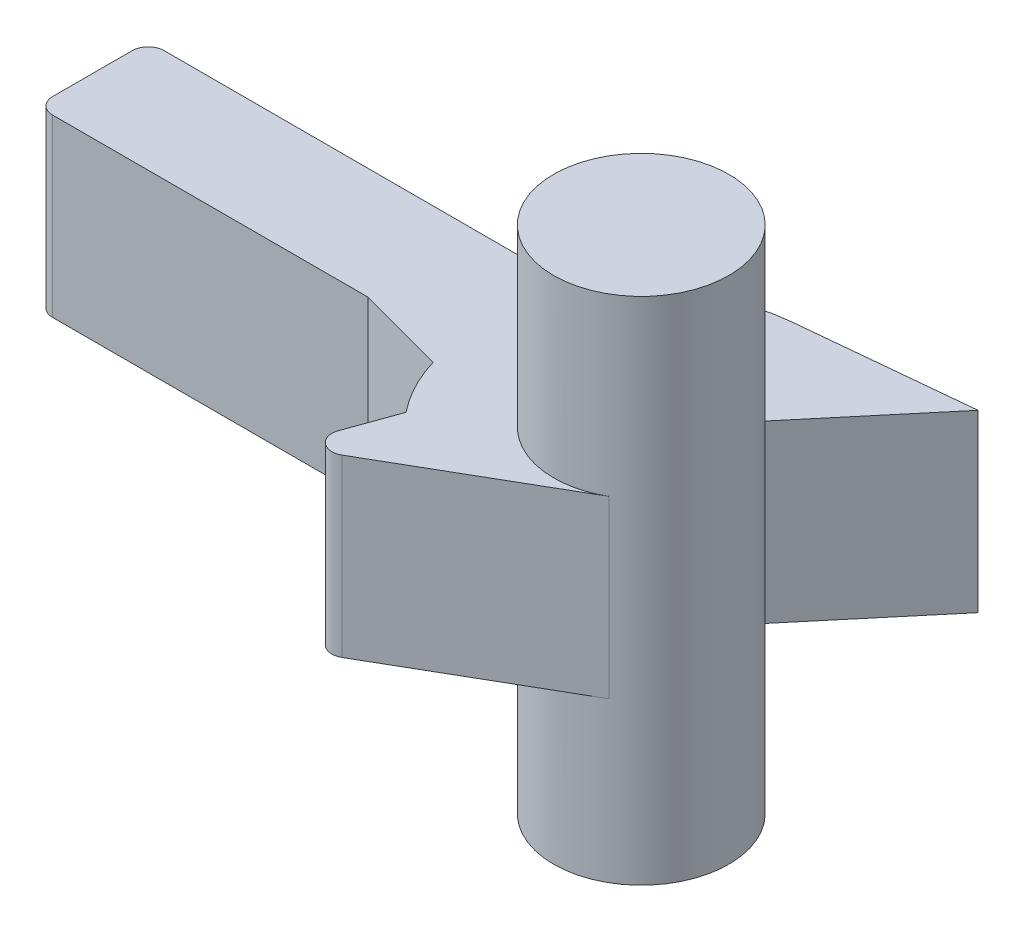
ISO-10303-21;
HEADER;
FILE_DESCRIPTION(('STEP AP214'),'2;1');
FILE_NAME('part.step','',(''),(''),'','','');
FILE_SCHEMA(('AUTOMOTIVE_DESIGN { 1 0 10303 214 1 1 1 1 }'));
ENDSEC;
DATA;
#1=APPLICATION_CONTEXT('core data for automotive mechanical design processes');
#2=APPLICATION_PROTOCOL_DEFINITION('international standard','automotive_design',2000,#1);
#3=PRODUCT_CONTEXT('',#1,'mechanical');
#4=PRODUCT('Part','Part','',(#3));
#5=PRODUCT_RELATED_PRODUCT_CATEGORY('part','',(#4));
#6=PRODUCT_DEFINITION_FORMATION('','',#4);
#7=PRODUCT_DEFINITION_CONTEXT('part definition',#1,'design');
#8=PRODUCT_DEFINITION('design','',#6,#7);
#9=PRODUCT_DEFINITION_SHAPE('','',#8);
#10=(LENGTH_UNIT() NAMED_UNIT(*) SI_UNIT(.MILLI.,.METRE.));
#11=(NAMED_UNIT(*) PLANE_ANGLE_UNIT() SI_UNIT($,.RADIAN.));
#12=(NAMED_UNIT(*) SI_UNIT($,.STERADIAN.) SOLID_ANGLE_UNIT());
#13=UNCERTAINTY_MEASURE_WITH_UNIT(LENGTH_MEASURE(1.E-05),#10,'distance_accuracy_value','');
#14=(GEOMETRIC_REPRESENTATION_CONTEXT(3) GLOBAL_UNCERTAINTY_ASSIGNED_CONTEXT((#13)) GLOBAL_UNIT_ASSIGNED_CONTEXT((#10,
#11,#12)) REPRESENTATION_CONTEXT('',''));
#15=CARTESIAN_POINT('',(0.,0.,0.));
#16=DIRECTION('',(0.,0.,1.));
#17=DIRECTION('',(1.,0.,0.));
#18=AXIS2_PLACEMENT_3D('',#15,#16,#17);
#19=CARTESIAN_POINT('',(0.,2.2,0.));
#20=DIRECTION('',(0.,-1.,0.));
#21=DIRECTION('',(0.,0.,-1.));
#22=AXIS2_PLACEMENT_3D('',#19,#20,#21);
#23=CYLINDRICAL_SURFACE('',#22,2.1);
#24=CARTESIAN_POINT('',(0.,0.,0.));
#25=DIRECTION('',(0.,1.,0.));
#26=DIRECTION('',(0.,0.,1.));
#27=AXIS2_PLACEMENT_3D('',#24,#25,#26);
#28=CIRCLE('',#27,2.1);
#29=CARTESIAN_POINT('',(-1.63925965501056,0.,1.31256534445134));
#30=VERTEX_POINT('',#29);
#31=CARTESIAN_POINT('',(-2.01260159665678,0.,0.599528825941312));
#32=VERTEX_POINT('',#31);
#33=EDGE_CURVE('E231',#30,#32,#28,.F.);
#34=ORIENTED_EDGE('',*,*,#33,.F.);
#35=DIRECTION('',(0.,-1.,0.));
#36=VECTOR('',#35,1.);
#37=CARTESIAN_POINT('',(-1.63925965501056,2.2,1.31256534445134));
#38=LINE('',#37,#36);
#39=CARTESIAN_POINT('',(-1.63925965501056,2.2,1.31256534445134));
#40=VERTEX_POINT('',#39);
#41=EDGE_CURVE('E151',#40,#30,#38,.T.);
#42=ORIENTED_EDGE('',*,*,#41,.F.);
#43=CARTESIAN_POINT('',(0.,2.2,0.));
#44=DIRECTION('',(0.,1.,0.));
#45=DIRECTION('',(0.,0.,1.));
#46=AXIS2_PLACEMENT_3D('',#43,#44,#45);
#47=CIRCLE('',#46,2.1);
#48=CARTESIAN_POINT('',(-2.01260159665678,2.2,0.599528825941312));
#49=VERTEX_POINT('',#48);
#50=EDGE_CURVE('E186',#40,#49,#47,.F.);
#51=ORIENTED_EDGE('',*,*,#50,.T.);
#52=DIRECTION('',(0.,-1.,0.));
#53=VECTOR('',#52,1.);
#54=CARTESIAN_POINT('',(-2.01260159665678,2.2,0.599528825941312));
#55=LINE('',#54,#53);
#56=EDGE_CURVE('E187',#49,#32,#55,.T.);
#57=ORIENTED_EDGE('',*,*,#56,.T.);
#58=EDGE_LOOP('',(#34,#42,#51,#57));
#59=FACE_BOUND('',#58,.T.);
#60=ADVANCED_FACE('F37',(#59),#23,.T.);
#61=CARTESIAN_POINT('',(-1.03544019896915,2.2,-0.371299871207522));
#62=DIRECTION('',(-0.941309271790139,0.,-0.337545337461383));
#63=DIRECTION('',(-0.337545337461383,0.,0.941309271790139));
#64=AXIS2_PLACEMENT_3D('',#61,#62,#63);
#65=PLANE('',#64);
#66=DIRECTION('',(0.337545337461383,0.,-0.941309271790139));
#67=VECTOR('',#66,1.);
#68=CARTESIAN_POINT('',(-1.03544019896915,0.,-0.371299871207522));
#69=LINE('',#68,#67);
#70=CARTESIAN_POINT('',(-1.863960572738,0.,1.93918652318646));
#71=VERTEX_POINT('',#70);
#72=EDGE_CURVE('E171',#71,#30,#69,.T.);
#73=ORIENTED_EDGE('',*,*,#72,.F.);
#74=DIRECTION('',(0.,-1.,0.));
#75=VECTOR('',#74,1.);
#76=CARTESIAN_POINT('',(-1.863960572738,2.2,1.93918652318646));
#77=LINE('',#76,#75);
#78=CARTESIAN_POINT('',(-1.863960572738,2.2,1.93918652318646));
#79=VERTEX_POINT('',#78);
#80=EDGE_CURVE('E11',#71,#79,#77,.F.);
#81=ORIENTED_EDGE('',*,*,#80,.T.);
#82=DIRECTION('',(0.337545337461383,0.,-0.941309271790139));
#83=VECTOR('',#82,1.);
#84=CARTESIAN_POINT('',(-1.03544019896915,2.2,-0.371299871207522));
#85=LINE('',#84,#83);
#86=EDGE_CURVE('E288',#79,#40,#85,.T.);
#87=ORIENTED_EDGE('',*,*,#86,.T.);
#88=ORIENTED_EDGE('',*,*,#41,.T.);
#89=EDGE_LOOP('',(#73,#81,#87,#88));
#90=FACE_BOUND('',#89,.T.);
#91=ADVANCED_FACE('F228',(#90),#65,.T.);
#92=CARTESIAN_POINT('',(0.550000000000005,2.2,0.95262794416288));
#93=DIRECTION('',(0.500000000000005,0.,0.866025403784436));
#94=DIRECTION('',(0.866025403784436,0.,-0.500000000000005));
#95=AXIS2_PLACEMENT_3D('',#92,#93,#94);
#96=PLANE('',#95);
#97=DIRECTION('',(-0.866025403784436,0.,0.500000000000005));
#98=VECTOR('',#97,1.);
#99=CARTESIAN_POINT('',(0.550000000000005,2.2,0.95262794416288));
#100=LINE('',#99,#98);
#101=CARTESIAN_POINT('',(0.550000000000005,2.2,0.95262794416288));
#102=VERTEX_POINT('',#101);
#103=CARTESIAN_POINT('',(-1.57569871837997,2.2,2.17990067143562));
#104=VERTEX_POINT('',#103);
#105=EDGE_CURVE('E225',#102,#104,#100,.T.);
#106=ORIENTED_EDGE('',*,*,#105,.T.);
#107=DIRECTION('',(0.,-1.,0.));
#108=VECTOR('',#107,1.);
#109=CARTESIAN_POINT('',(-1.57569871837997,2.2,2.17990067143562));
#110=LINE('',#109,#108);
#111=CARTESIAN_POINT('',(-1.57569871837997,0.,2.17990067143562));
#112=VERTEX_POINT('',#111);
#113=EDGE_CURVE('E45',#104,#112,#110,.T.);
#114=ORIENTED_EDGE('',*,*,#113,.T.);
#115=DIRECTION('',(-0.866025403784436,0.,0.500000000000005));
#116=VECTOR('',#115,1.);
#117=CARTESIAN_POINT('',(0.550000000000005,0.,0.95262794416288));
#118=LINE('',#117,#116);
#119=CARTESIAN_POINT('',(0.550000000000005,0.,0.95262794416288));
#120=VERTEX_POINT('',#119);
#121=EDGE_CURVE('E167',#120,#112,#118,.T.);
#122=ORIENTED_EDGE('',*,*,#121,.F.);
#123=DIRECTION('',(0.,-1.,0.));
#124=VECTOR('',#123,1.);
#125=CARTESIAN_POINT('',(0.550000000000005,2.2,0.95262794416288));
#126=LINE('',#125,#124);
#127=EDGE_CURVE('E145',#102,#120,#126,.T.);
#128=ORIENTED_EDGE('',*,*,#127,.F.);
#129=EDGE_LOOP('',(#106,#114,#122,#128));
#130=FACE_BOUND('',#129,.T.);
#131=ADVANCED_FACE('F224',(#130),#96,.T.);
#132=CARTESIAN_POINT('',(0.,2.2,0.));
#133=DIRECTION('',(0.,-1.,0.));
#134=DIRECTION('',(0.,0.,-1.));
#135=AXIS2_PLACEMENT_3D('',#132,#133,#134);
#136=CYLINDRICAL_SURFACE('',#135,1.1);
#137=ORIENTED_EDGE('',*,*,#127,.T.);
#138=CARTESIAN_POINT('',(0.,0.,0.));
#139=DIRECTION('',(0.,1.,0.));
#140=DIRECTION('',(0.,0.,1.));
#141=AXIS2_PLACEMENT_3D('',#138,#139,#140);
#142=CIRCLE('',#141,1.1);
#143=CARTESIAN_POINT('',(0.707066370655197,0.,-0.842648887430873));
#144=VERTEX_POINT('',#143);
#145=EDGE_CURVE('E137',#144,#120,#142,.T.);
#146=ORIENTED_EDGE('',*,*,#145,.F.);
#147=DIRECTION('',(0.,-1.,0.));
#148=VECTOR('',#147,1.);
#149=CARTESIAN_POINT('',(0.707066370655197,2.2,-0.842648887430873));
#150=LINE('',#149,#148);
#151=CARTESIAN_POINT('',(0.707066370655197,2.2,-0.842648887430873));
#152=VERTEX_POINT('',#151);
#153=EDGE_CURVE('E142',#152,#144,#150,.T.);
#154=ORIENTED_EDGE('',*,*,#153,.F.);
#155=CARTESIAN_POINT('',(0.,2.2,0.));
#156=DIRECTION('',(0.,1.,0.));
#157=DIRECTION('',(0.,0.,1.));
#158=AXIS2_PLACEMENT_3D('',#155,#156,#157);
#159=CIRCLE('',#158,1.1);
#160=EDGE_CURVE('E277',#152,#102,#159,.T.);
#161=ORIENTED_EDGE('',*,*,#160,.T.);
#162=EDGE_LOOP('',(#137,#146,#154,#161));
#163=FACE_BOUND('',#162,.T.);
#164=CARTESIAN_POINT('',(0.,-2.,0.));
#165=DIRECTION('',(0.,1.,0.));
#166=DIRECTION('',(0.,0.,1.));
#167=AXIS2_PLACEMENT_3D('',#164,#165,#166);
#168=CIRCLE('',#167,1.1);
#169=CARTESIAN_POINT('',(0.,-2.,1.1));
#170=VERTEX_POINT('',#169);
#171=EDGE_CURVE('E279',#170,#170,#168,.T.);
#172=ORIENTED_EDGE('',*,*,#171,.T.);
#173=EDGE_LOOP('',(#172));
#174=FACE_BOUND('',#173,.T.);
#175=CARTESIAN_POINT('',(0.,4.4,0.));
#176=DIRECTION('',(0.,1.,0.));
#177=DIRECTION('',(0.,0.,1.));
#178=AXIS2_PLACEMENT_3D('',#175,#176,#177);
#179=CIRCLE('',#178,1.1);
#180=CARTESIAN_POINT('',(0.,4.4,1.1));
#181=VERTEX_POINT('',#180);
#182=EDGE_CURVE('E282',#181,#181,#179,.T.);
#183=ORIENTED_EDGE('',*,*,#182,.F.);
#184=EDGE_LOOP('',(#183));
#185=FACE_BOUND('',#184,.T.);
#186=ADVANCED_FACE('F139',(#163,#174,#185),#136,.T.);
#187=CARTESIAN_POINT('',(0.,2.2,0.));
#188=DIRECTION('',(-0.766044443118975,0.,-0.642787609686543));
#189=DIRECTION('',(-0.642787609686543,0.,0.766044443118975));
#190=AXIS2_PLACEMENT_3D('',#187,#188,#189);
#191=PLANE('',#190);
#192=DIRECTION('',(0.642787609686543,0.,-0.766044443118975));
#193=VECTOR('',#192,1.);
#194=CARTESIAN_POINT('',(0.,0.,0.));
#195=LINE('',#194,#193);
#196=CARTESIAN_POINT('',(1.92836282905963,0.,-2.29813332935693));
#197=VERTEX_POINT('',#196);
#198=EDGE_CURVE('E156',#144,#197,#195,.T.);
#199=ORIENTED_EDGE('',*,*,#198,.T.);
#200=DIRECTION('',(0.,-1.,0.));
#201=VECTOR('',#200,1.);
#202=CARTESIAN_POINT('',(1.92836282905963,2.2,-2.29813332935693));
#203=LINE('',#202,#201);
#204=CARTESIAN_POINT('',(1.92836282905963,2.2,-2.29813332935693));
#205=VERTEX_POINT('',#204);
#206=EDGE_CURVE('E159',#205,#197,#203,.T.);
#207=ORIENTED_EDGE('',*,*,#206,.F.);
#208=DIRECTION('',(0.642787609686543,0.,-0.766044443118975));
#209=VECTOR('',#208,1.);
#210=CARTESIAN_POINT('',(0.,2.2,0.));
#211=LINE('',#210,#209);
#212=EDGE_CURVE('E158',#152,#205,#211,.T.);
#213=ORIENTED_EDGE('',*,*,#212,.F.);
#214=ORIENTED_EDGE('',*,*,#153,.T.);
#215=EDGE_LOOP('',(#199,#207,#213,#214));
#216=FACE_BOUND('',#215,.T.);
#217=ADVANCED_FACE('F154',(#216),#191,.F.);
#218=CARTESIAN_POINT('',(-0.203939042120377,2.2,-2.09007389034432));
#219=DIRECTION('',(0.0971138295811318,0.,0.995273281116341));
#220=DIRECTION('',(0.995273281116341,0.,-0.0971138295811318));
#221=AXIS2_PLACEMENT_3D('',#218,#219,#220);
#222=PLANE('',#221);
#223=DIRECTION('',(-0.995273281116341,0.,0.0971138295811318));
#224=VECTOR('',#223,1.);
#225=CARTESIAN_POINT('',(-0.203939042120377,0.,-2.09007389034432));
#226=LINE('',#225,#224);
#227=CARTESIAN_POINT('',(-0.203939042120377,0.,-2.09007389034432));
#228=VERTEX_POINT('',#227);
#229=EDGE_CURVE('E166',#197,#228,#226,.T.);
#230=ORIENTED_EDGE('',*,*,#229,.T.);
#231=DIRECTION('',(0.,-1.,0.));
#232=VECTOR('',#231,1.);
#233=CARTESIAN_POINT('',(-0.203939042120377,2.2,-2.09007389034432));
#234=LINE('',#233,#232);
#235=CARTESIAN_POINT('',(-0.203939042120377,2.2,-2.09007389034432));
#236=VERTEX_POINT('',#235);
#237=EDGE_CURVE('E196',#236,#228,#234,.T.);
#238=ORIENTED_EDGE('',*,*,#237,.F.);
#239=DIRECTION('',(-0.995273281116341,0.,0.0971138295811318));
#240=VECTOR('',#239,1.);
#241=CARTESIAN_POINT('',(-0.203939042120377,2.2,-2.09007389034432));
#242=LINE('',#241,#240);
#243=EDGE_CURVE('E292',#205,#236,#242,.T.);
#244=ORIENTED_EDGE('',*,*,#243,.F.);
#245=ORIENTED_EDGE('',*,*,#206,.T.);
#246=EDGE_LOOP('',(#230,#238,#244,#245));
#247=FACE_BOUND('',#246,.T.);
#248=ADVANCED_FACE('F310',(#247),#222,.F.);
#249=CARTESIAN_POINT('',(0.,2.2,0.));
#250=DIRECTION('',(0.,-1.,0.));
#251=DIRECTION('',(0.,0.,-1.));
#252=AXIS2_PLACEMENT_3D('',#249,#250,#251);
#253=CYLINDRICAL_SURFACE('',#252,2.1);
#254=CARTESIAN_POINT('',(0.,0.,0.));
#255=DIRECTION('',(0.,1.,0.));
#256=DIRECTION('',(0.,0.,1.));
#257=AXIS2_PLACEMENT_3D('',#254,#255,#256);
#258=CIRCLE('',#257,2.1);
#259=CARTESIAN_POINT('',(-1.78885438199983,0.,-1.1));
#260=VERTEX_POINT('',#259);
#261=EDGE_CURVE('E169',#260,#228,#258,.F.);
#262=ORIENTED_EDGE('',*,*,#261,.F.);
#263=DIRECTION('',(0.,-1.,0.));
#264=VECTOR('',#263,1.);
#265=CARTESIAN_POINT('',(-1.78885438199983,2.2,-1.1));
#266=LINE('',#265,#264);
#267=CARTESIAN_POINT('',(-1.78885438199983,2.2,-1.1));
#268=VERTEX_POINT('',#267);
#269=EDGE_CURVE('E193',#268,#260,#266,.T.);
#270=ORIENTED_EDGE('',*,*,#269,.F.);
#271=CARTESIAN_POINT('',(0.,2.2,0.));
#272=DIRECTION('',(0.,1.,0.));
#273=DIRECTION('',(0.,0.,1.));
#274=AXIS2_PLACEMENT_3D('',#271,#272,#273);
#275=CIRCLE('',#274,2.1);
#276=EDGE_CURVE('E294',#268,#236,#275,.F.);
#277=ORIENTED_EDGE('',*,*,#276,.T.);
#278=ORIENTED_EDGE('',*,*,#237,.T.);
#279=EDGE_LOOP('',(#262,#270,#277,#278));
#280=FACE_BOUND('',#279,.T.);
#281=ADVANCED_FACE('F306',(#280),#253,.T.);
#282=CARTESIAN_POINT('',(0.,2.2,-1.1));
#283=DIRECTION('',(0.,0.,-1.));
#284=DIRECTION('',(-1.,0.,0.));
#285=AXIS2_PLACEMENT_3D('',#282,#283,#284);
#286=PLANE('',#285);
#287=DIRECTION('',(1.,0.,0.));
#288=VECTOR('',#287,1.);
#289=CARTESIAN_POINT('',(0.,0.,-1.1));
#290=LINE('',#289,#288);
#291=CARTESIAN_POINT('',(-7.08885438199983,0.,-1.1));
#292=VERTEX_POINT('',#291);
#293=EDGE_CURVE('E176',#292,#260,#290,.T.);
#294=ORIENTED_EDGE('',*,*,#293,.F.);
#295=DIRECTION('',(0.,-1.,0.));
#296=VECTOR('',#295,1.);
#297=CARTESIAN_POINT('',(-7.08885438199983,2.2,-1.1));
#298=LINE('',#297,#296);
#299=CARTESIAN_POINT('',(-7.08885438199983,2.2,-1.1));
#300=VERTEX_POINT('',#299);
#301=EDGE_CURVE('E220',#292,#300,#298,.F.);
#302=ORIENTED_EDGE('',*,*,#301,.T.);
#303=DIRECTION('',(1.,0.,0.));
#304=VECTOR('',#303,1.);
#305=CARTESIAN_POINT('',(0.,2.2,-1.1));
#306=LINE('',#305,#304);
#307=EDGE_CURVE('E273',#300,#268,#306,.T.);
#308=ORIENTED_EDGE('',*,*,#307,.T.);
#309=ORIENTED_EDGE('',*,*,#269,.T.);
#310=EDGE_LOOP('',(#294,#302,#308,#309));
#311=FACE_BOUND('',#310,.T.);
#312=ADVANCED_FACE('F300',(#311),#286,.T.);
#313=CARTESIAN_POINT('',(-7.28885438199983,2.2,0.));
#314=DIRECTION('',(1.,0.,0.));
#315=DIRECTION('',(0.,0.,-1.));
#316=AXIS2_PLACEMENT_3D('',#313,#314,#315);
#317=PLANE('',#316);
#318=DIRECTION('',(0.,0.,1.));
#319=VECTOR('',#318,1.);
#320=CARTESIAN_POINT('',(-7.28885438199983,0.,0.));
#321=LINE('',#320,#319);
#322=CARTESIAN_POINT('',(-7.28885438199983,0.,-0.899999999999999));
#323=VERTEX_POINT('',#322);
#324=CARTESIAN_POINT('',(-7.28885438199983,0.,0.100000000000001));
#325=VERTEX_POINT('',#324);
#326=EDGE_CURVE('E178',#323,#325,#321,.T.);
#327=ORIENTED_EDGE('',*,*,#326,.T.);
#328=DIRECTION('',(0.,-1.,0.));
#329=VECTOR('',#328,1.);
#330=CARTESIAN_POINT('',(-7.28885438199983,2.2,0.100000000000001));
#331=LINE('',#330,#329);
#332=CARTESIAN_POINT('',(-7.28885438199983,2.2,0.100000000000001));
#333=VERTEX_POINT('',#332);
#334=EDGE_CURVE('E213',#325,#333,#331,.F.);
#335=ORIENTED_EDGE('',*,*,#334,.T.);
#336=DIRECTION('',(0.,0.,1.));
#337=VECTOR('',#336,1.);
#338=CARTESIAN_POINT('',(-7.28885438199983,2.2,0.));
#339=LINE('',#338,#337);
#340=CARTESIAN_POINT('',(-7.28885438199983,2.2,-0.899999999999999));
#341=VERTEX_POINT('',#340);
#342=EDGE_CURVE('E267',#341,#333,#339,.T.);
#343=ORIENTED_EDGE('',*,*,#342,.F.);
#344=DIRECTION('',(0.,-1.,0.));
#345=VECTOR('',#344,1.);
#346=CARTESIAN_POINT('',(-7.28885438199983,0.,-0.899999999999999));
#347=LINE('',#346,#345);
#348=EDGE_CURVE('E210',#341,#323,#347,.T.);
#349=ORIENTED_EDGE('',*,*,#348,.T.);
#350=EDGE_LOOP('',(#327,#335,#343,#349));
#351=FACE_BOUND('',#350,.T.);
#352=ADVANCED_FACE('F314',(#351),#317,.F.);
#353=CARTESIAN_POINT('',(0.,2.2,0.300000000000001));
#354=DIRECTION('',(0.,0.,-1.));
#355=DIRECTION('',(-1.,0.,0.));
#356=AXIS2_PLACEMENT_3D('',#353,#354,#355);
#357=PLANE('',#356);
#358=DIRECTION('',(1.,0.,0.));
#359=VECTOR('',#358,1.);
#360=CARTESIAN_POINT('',(0.,2.2,0.300000000000001));
#361=LINE('',#360,#359);
#362=CARTESIAN_POINT('',(-7.08885438199983,2.2,0.300000000000001));
#363=VERTEX_POINT('',#362);
#364=CARTESIAN_POINT('',(-3.13045839340119,2.2,0.300000000000001));
#365=VERTEX_POINT('',#364);
#366=EDGE_CURVE('E264',#363,#365,#361,.T.);
#367=ORIENTED_EDGE('',*,*,#366,.F.);
#368=DIRECTION('',(0.,-1.,0.));
#369=VECTOR('',#368,1.);
#370=CARTESIAN_POINT('',(-7.08885438199983,2.2,0.300000000000001));
#371=LINE('',#370,#369);
#372=CARTESIAN_POINT('',(-7.08885438199983,0.,0.300000000000001));
#373=VERTEX_POINT('',#372);
#374=EDGE_CURVE('E150',#363,#373,#371,.T.);
#375=ORIENTED_EDGE('',*,*,#374,.T.);
#376=DIRECTION('',(1.,0.,0.));
#377=VECTOR('',#376,1.);
#378=CARTESIAN_POINT('',(0.,0.,0.300000000000001));
#379=LINE('',#378,#377);
#380=CARTESIAN_POINT('',(-3.13045839340119,0.,0.300000000000001));
#381=VERTEX_POINT('',#380);
#382=EDGE_CURVE('E181',#373,#381,#379,.T.);
#383=ORIENTED_EDGE('',*,*,#382,.T.);
#384=DIRECTION('',(0.,-1.,0.));
#385=VECTOR('',#384,1.);
#386=CARTESIAN_POINT('',(-3.13045839340119,2.2,0.300000000000001));
#387=LINE('',#386,#385);
#388=EDGE_CURVE('E189',#365,#381,#387,.T.);
#389=ORIENTED_EDGE('',*,*,#388,.F.);
#390=EDGE_LOOP('',(#367,#375,#383,#389));
#391=FACE_BOUND('',#390,.T.);
#392=ADVANCED_FACE('F269',(#391),#357,.F.);
#393=CARTESIAN_POINT('',(-0.284700949612777,2.2,1.06251840891797));
#394=DIRECTION('',(-0.258819045102524,0.,0.965925826289067));
#395=DIRECTION('',(0.965925826289068,0.,0.258819045102524));
#396=AXIS2_PLACEMENT_3D('',#393,#394,#395);
#397=PLANE('',#396);
#398=DIRECTION('',(-0.965925826289067,0.,-0.258819045102524));
#399=VECTOR('',#398,1.);
#400=CARTESIAN_POINT('',(-0.284700949612777,0.,1.06251840891797));
#401=LINE('',#400,#399);
#402=EDGE_CURVE('E183',#32,#381,#401,.T.);
#403=ORIENTED_EDGE('',*,*,#402,.F.);
#404=ORIENTED_EDGE('',*,*,#56,.F.);
#405=DIRECTION('',(-0.965925826289067,0.,-0.258819045102524));
#406=VECTOR('',#405,1.);
#407=CARTESIAN_POINT('',(-0.284700949612777,2.2,1.06251840891797));
#408=LINE('',#407,#406);
#409=EDGE_CURVE('E190',#49,#365,#408,.T.);
#410=ORIENTED_EDGE('',*,*,#409,.T.);
#411=ORIENTED_EDGE('',*,*,#388,.T.);
#412=EDGE_LOOP('',(#403,#404,#410,#411));
#413=FACE_BOUND('',#412,.T.);
#414=ADVANCED_FACE('F316',(#413),#397,.T.);
#415=CARTESIAN_POINT('',(0.,2.2,0.));
#416=DIRECTION('',(0.,1.,0.));
#417=DIRECTION('',(0.,0.,1.));
#418=AXIS2_PLACEMENT_3D('',#415,#416,#417);
#419=PLANE('',#418);
#420=ORIENTED_EDGE('',*,*,#342,.T.);
#421=CARTESIAN_POINT('',(-7.08885438199983,2.2,0.100000000000001));
#422=DIRECTION('',(0.,1.,0.));
#423=DIRECTION('',(0.,0.,1.));
#424=AXIS2_PLACEMENT_3D('',#421,#422,#423);
#425=CIRCLE('',#424,0.2);
#426=EDGE_CURVE('E218',#333,#363,#425,.T.);
#427=ORIENTED_EDGE('',*,*,#426,.T.);
#428=ORIENTED_EDGE('',*,*,#366,.T.);
#429=ORIENTED_EDGE('',*,*,#409,.F.);
#430=ORIENTED_EDGE('',*,*,#50,.F.);
#431=ORIENTED_EDGE('',*,*,#86,.F.);
#432=CARTESIAN_POINT('',(-1.67569871837998,2.2,2.00669559067873));
#433=DIRECTION('',(0.,1.,0.));
#434=DIRECTION('',(0.,0.,1.));
#435=AXIS2_PLACEMENT_3D('',#432,#433,#434);
#436=CIRCLE('',#435,0.2);
#437=EDGE_CURVE('E52',#79,#104,#436,.T.);
#438=ORIENTED_EDGE('',*,*,#437,.T.);
#439=ORIENTED_EDGE('',*,*,#105,.F.);
#440=ORIENTED_EDGE('',*,*,#160,.F.);
#441=ORIENTED_EDGE('',*,*,#212,.T.);
#442=ORIENTED_EDGE('',*,*,#243,.T.);
#443=ORIENTED_EDGE('',*,*,#276,.F.);
#444=ORIENTED_EDGE('',*,*,#307,.F.);
#445=CARTESIAN_POINT('',(-7.08885438199983,2.2,-0.899999999999999));
#446=DIRECTION('',(0.,1.,0.));
#447=DIRECTION('',(0.,0.,1.));
#448=AXIS2_PLACEMENT_3D('',#445,#446,#447);
#449=CIRCLE('',#448,0.2);
#450=EDGE_CURVE('E216',#300,#341,#449,.T.);
#451=ORIENTED_EDGE('',*,*,#450,.T.);
#452=EDGE_LOOP('',(#420,#427,#428,#429,#430,#431,#438,#439,#440,#441,#442,#443,#444,#451));
#453=FACE_BOUND('',#452,.T.);
#454=ADVANCED_FACE('F262',(#453),#419,.T.);
#455=CARTESIAN_POINT('',(0.,0.,0.));
#456=DIRECTION('',(0.,1.,0.));
#457=DIRECTION('',(0.,0.,1.));
#458=AXIS2_PLACEMENT_3D('',#455,#456,#457);
#459=PLANE('',#458);
#460=ORIENTED_EDGE('',*,*,#382,.F.);
#461=CARTESIAN_POINT('',(-7.08885438199983,0.,0.100000000000001));
#462=DIRECTION('',(0.,1.,0.));
#463=DIRECTION('',(0.,0.,1.));
#464=AXIS2_PLACEMENT_3D('',#461,#462,#463);
#465=CIRCLE('',#464,0.2);
#466=EDGE_CURVE('E208',#373,#325,#465,.F.);
#467=ORIENTED_EDGE('',*,*,#466,.T.);
#468=ORIENTED_EDGE('',*,*,#326,.F.);
#469=CARTESIAN_POINT('',(-7.08885438199983,0.,-0.899999999999999));
#470=DIRECTION('',(0.,1.,0.));
#471=DIRECTION('',(0.,0.,1.));
#472=AXIS2_PLACEMENT_3D('',#469,#470,#471);
#473=CIRCLE('',#472,0.2);
#474=EDGE_CURVE('E206',#323,#292,#473,.F.);
#475=ORIENTED_EDGE('',*,*,#474,.T.);
#476=ORIENTED_EDGE('',*,*,#293,.T.);
#477=ORIENTED_EDGE('',*,*,#261,.T.);
#478=ORIENTED_EDGE('',*,*,#229,.F.);
#479=ORIENTED_EDGE('',*,*,#198,.F.);
#480=ORIENTED_EDGE('',*,*,#145,.T.);
#481=ORIENTED_EDGE('',*,*,#121,.T.);
#482=CARTESIAN_POINT('',(-1.67569871837998,0.,2.00669559067873));
#483=DIRECTION('',(0.,1.,0.));
#484=DIRECTION('',(0.,0.,1.));
#485=AXIS2_PLACEMENT_3D('',#482,#483,#484);
#486=CIRCLE('',#485,0.2);
#487=EDGE_CURVE('E204',#112,#71,#486,.F.);
#488=ORIENTED_EDGE('',*,*,#487,.T.);
#489=ORIENTED_EDGE('',*,*,#72,.T.);
#490=ORIENTED_EDGE('',*,*,#33,.T.);
#491=ORIENTED_EDGE('',*,*,#402,.T.);
#492=EDGE_LOOP('',(#460,#467,#468,#475,#476,#477,#478,#479,#480,#481,#488,#489,#490,#491));
#493=FACE_BOUND('',#492,.T.);
#494=ADVANCED_FACE('F163',(#493),#459,.F.);
#495=CARTESIAN_POINT('',(0.,-2.,0.));
#496=DIRECTION('',(0.,1.,0.));
#497=DIRECTION('',(0.,0.,1.));
#498=AXIS2_PLACEMENT_3D('',#495,#496,#497);
#499=PLANE('',#498);
#500=ORIENTED_EDGE('',*,*,#171,.F.);
#501=EDGE_LOOP('',(#500));
#502=FACE_BOUND('',#501,.T.);
#503=ADVANCED_FACE('F254',(#502),#499,.F.);
#504=CARTESIAN_POINT('',(0.,4.4,0.));
#505=DIRECTION('',(0.,1.,0.));
#506=DIRECTION('',(0.,0.,1.));
#507=AXIS2_PLACEMENT_3D('',#504,#505,#506);
#508=PLANE('',#507);
#509=ORIENTED_EDGE('',*,*,#182,.T.);
#510=EDGE_LOOP('',(#509));
#511=FACE_BOUND('',#510,.T.);
#512=ADVANCED_FACE('F249',(#511),#508,.T.);
#513=CARTESIAN_POINT('',(-7.08885438199983,2.2,0.100000000000001));
#514=DIRECTION('',(0.,-1.,0.));
#515=DIRECTION('',(0.,0.,-1.));
#516=AXIS2_PLACEMENT_3D('',#513,#514,#515);
#517=CYLINDRICAL_SURFACE('',#516,0.2);
#518=ORIENTED_EDGE('',*,*,#426,.F.);
#519=ORIENTED_EDGE('',*,*,#334,.F.);
#520=ORIENTED_EDGE('',*,*,#466,.F.);
#521=ORIENTED_EDGE('',*,*,#374,.F.);
#522=EDGE_LOOP('',(#518,#519,#520,#521));
#523=FACE_BOUND('',#522,.T.);
#524=ADVANCED_FACE('F237',(#523),#517,.T.);
#525=CARTESIAN_POINT('',(-7.08885438199983,2.2,-0.899999999999999));
#526=DIRECTION('',(0.,1.,0.));
#527=DIRECTION('',(0.,0.,1.));
#528=AXIS2_PLACEMENT_3D('',#525,#526,#527);
#529=CYLINDRICAL_SURFACE('',#528,0.2);
#530=ORIENTED_EDGE('',*,*,#450,.F.);
#531=ORIENTED_EDGE('',*,*,#301,.F.);
#532=ORIENTED_EDGE('',*,*,#474,.F.);
#533=ORIENTED_EDGE('',*,*,#348,.F.);
#534=EDGE_LOOP('',(#530,#531,#532,#533));
#535=FACE_BOUND('',#534,.T.);
#536=ADVANCED_FACE('F233',(#535),#529,.T.);
#537=CARTESIAN_POINT('',(-1.67569871837998,2.2,2.00669559067873));
#538=DIRECTION('',(0.,-1.,0.));
#539=DIRECTION('',(0.,0.,-1.));
#540=AXIS2_PLACEMENT_3D('',#537,#538,#539);
#541=CYLINDRICAL_SURFACE('',#540,0.2);
#542=ORIENTED_EDGE('',*,*,#437,.F.);
#543=ORIENTED_EDGE('',*,*,#80,.F.);
#544=ORIENTED_EDGE('',*,*,#487,.F.);
#545=ORIENTED_EDGE('',*,*,#113,.F.);
#546=EDGE_LOOP('',(#542,#543,#544,#545));
#547=FACE_BOUND('',#546,.T.);
#548=ADVANCED_FACE('F39',(#547),#541,.T.);
#549=CLOSED_SHELL('',(#60,#91,#131,#186,#217,#248,#281,#312,#352,#392,#414,#454,#494,#503,#512,
#524,#536,#548));
#550=MANIFOLD_SOLID_BREP('B2',#549);
#551=ADVANCED_BREP_SHAPE_REPRESENTATION('',(#18,#550),#14);
#552=SHAPE_DEFINITION_REPRESENTATION(#9,#551);
ENDSEC;
END-ISO-10303-21;
